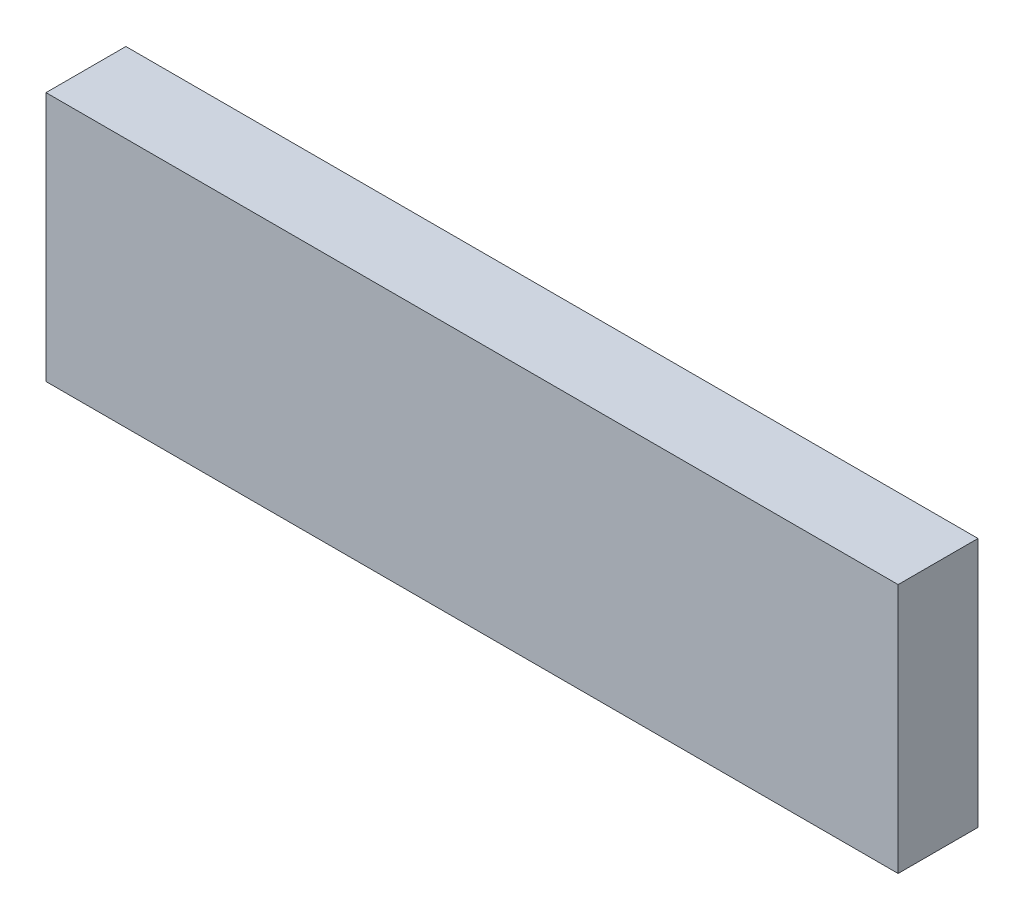
ISO-10303-21;
HEADER;
FILE_DESCRIPTION(('STEP AP214'),'2;1');
FILE_NAME('part.step','',(''),(''),'','','');
FILE_SCHEMA(('AUTOMOTIVE_DESIGN { 1 0 10303 214 1 1 1 1 }'));
ENDSEC;
DATA;
#1=APPLICATION_CONTEXT('core data for automotive mechanical design processes');
#2=APPLICATION_PROTOCOL_DEFINITION('international standard','automotive_design',2000,#1);
#3=PRODUCT_CONTEXT('',#1,'mechanical');
#4=PRODUCT('Part','Part','',(#3));
#5=PRODUCT_RELATED_PRODUCT_CATEGORY('part','',(#4));
#6=PRODUCT_DEFINITION_FORMATION('','',#4);
#7=PRODUCT_DEFINITION_CONTEXT('part definition',#1,'design');
#8=PRODUCT_DEFINITION('design','',#6,#7);
#9=PRODUCT_DEFINITION_SHAPE('','',#8);
#10=(LENGTH_UNIT() NAMED_UNIT(*) SI_UNIT(.MILLI.,.METRE.));
#11=(NAMED_UNIT(*) PLANE_ANGLE_UNIT() SI_UNIT($,.RADIAN.));
#12=(NAMED_UNIT(*) SI_UNIT($,.STERADIAN.) SOLID_ANGLE_UNIT());
#13=UNCERTAINTY_MEASURE_WITH_UNIT(LENGTH_MEASURE(1.E-05),#10,'distance_accuracy_value','');
#14=(GEOMETRIC_REPRESENTATION_CONTEXT(3) GLOBAL_UNCERTAINTY_ASSIGNED_CONTEXT((#13)) GLOBAL_UNIT_ASSIGNED_CONTEXT((#10,
#11,#12)) REPRESENTATION_CONTEXT('',''));
#15=CARTESIAN_POINT('',(0.,0.,0.));
#16=DIRECTION('',(0.,0.,1.));
#17=DIRECTION('',(1.,0.,0.));
#18=AXIS2_PLACEMENT_3D('',#15,#16,#17);
#19=CARTESIAN_POINT('',(21.4376,7.62,5.));
#20=DIRECTION('',(0.,0.,-1.));
#21=DIRECTION('',(-1.,0.,0.));
#22=AXIS2_PLACEMENT_3D('',#19,#20,#21);
#23=PLANE('',#22);
#24=DIRECTION('',(0.,1.,0.));
#25=VECTOR('',#24,1.);
#26=CARTESIAN_POINT('',(-10.5664,7.62,5.));
#27=LINE('',#26,#25);
#28=CARTESIAN_POINT('',(-10.5664,7.62,5.));
#29=VERTEX_POINT('',#28);
#30=CARTESIAN_POINT('',(-10.5664,-1.778,5.));
#31=VERTEX_POINT('',#30);
#32=EDGE_CURVE('E55',#29,#31,#27,.F.);
#33=ORIENTED_EDGE('',*,*,#32,.T.);
#34=DIRECTION('',(1.,0.,0.));
#35=VECTOR('',#34,1.);
#36=CARTESIAN_POINT('',(-10.5664,-1.778,5.));
#37=LINE('',#36,#35);
#38=CARTESIAN_POINT('',(21.4376,-1.778,5.));
#39=VERTEX_POINT('',#38);
#40=EDGE_CURVE('E57',#31,#39,#37,.T.);
#41=ORIENTED_EDGE('',*,*,#40,.T.);
#42=DIRECTION('',(0.,1.,0.));
#43=VECTOR('',#42,1.);
#44=CARTESIAN_POINT('',(21.4376,-1.778,5.));
#45=LINE('',#44,#43);
#46=CARTESIAN_POINT('',(21.4376,7.62,5.));
#47=VERTEX_POINT('',#46);
#48=EDGE_CURVE('E20',#39,#47,#45,.T.);
#49=ORIENTED_EDGE('',*,*,#48,.T.);
#50=DIRECTION('',(1.,0.,0.));
#51=VECTOR('',#50,1.);
#52=CARTESIAN_POINT('',(21.4376,7.62,5.));
#53=LINE('',#52,#51);
#54=EDGE_CURVE('E80',#47,#29,#53,.F.);
#55=ORIENTED_EDGE('',*,*,#54,.T.);
#56=EDGE_LOOP('',(#33,#41,#49,#55));
#57=FACE_BOUND('',#56,.T.);
#58=ADVANCED_FACE('F17',(#57),#23,.F.);
#59=CARTESIAN_POINT('',(21.4376,-1.778,2.));
#60=DIRECTION('',(-1.,0.,0.));
#61=DIRECTION('',(0.,0.,1.));
#62=AXIS2_PLACEMENT_3D('',#59,#60,#61);
#63=PLANE('',#62);
#64=DIRECTION('',(0.,0.,-1.));
#65=VECTOR('',#64,1.);
#66=CARTESIAN_POINT('',(21.4376,7.62,2.));
#67=LINE('',#66,#65);
#68=CARTESIAN_POINT('',(21.4376,7.62,2.));
#69=VERTEX_POINT('',#68);
#70=EDGE_CURVE('E68',#69,#47,#67,.F.);
#71=ORIENTED_EDGE('',*,*,#70,.T.);
#72=ORIENTED_EDGE('',*,*,#48,.F.);
#73=DIRECTION('',(0.,0.,1.));
#74=VECTOR('',#73,1.);
#75=CARTESIAN_POINT('',(21.4376,-1.778,2.));
#76=LINE('',#75,#74);
#77=CARTESIAN_POINT('',(21.4376,-1.778,2.));
#78=VERTEX_POINT('',#77);
#79=EDGE_CURVE('E63',#39,#78,#76,.F.);
#80=ORIENTED_EDGE('',*,*,#79,.T.);
#81=DIRECTION('',(0.,1.,0.));
#82=VECTOR('',#81,1.);
#83=CARTESIAN_POINT('',(21.4376,7.62,2.));
#84=LINE('',#83,#82);
#85=EDGE_CURVE('E83',#69,#78,#84,.F.);
#86=ORIENTED_EDGE('',*,*,#85,.F.);
#87=EDGE_LOOP('',(#71,#72,#80,#86));
#88=FACE_BOUND('',#87,.T.);
#89=ADVANCED_FACE('F65',(#88),#63,.F.);
#90=CARTESIAN_POINT('',(-10.5664,-1.778,2.));
#91=DIRECTION('',(0.,1.,0.));
#92=DIRECTION('',(0.,0.,1.));
#93=AXIS2_PLACEMENT_3D('',#90,#91,#92);
#94=PLANE('',#93);
#95=ORIENTED_EDGE('',*,*,#79,.F.);
#96=ORIENTED_EDGE('',*,*,#40,.F.);
#97=DIRECTION('',(0.,0.,-1.));
#98=VECTOR('',#97,1.);
#99=CARTESIAN_POINT('',(-10.5664,-1.778,2.));
#100=LINE('',#99,#98);
#101=CARTESIAN_POINT('',(-10.5664,-1.778,2.));
#102=VERTEX_POINT('',#101);
#103=EDGE_CURVE('E75',#31,#102,#100,.T.);
#104=ORIENTED_EDGE('',*,*,#103,.T.);
#105=DIRECTION('',(-1.,0.,0.));
#106=VECTOR('',#105,1.);
#107=CARTESIAN_POINT('',(21.4376,-1.778,2.));
#108=LINE('',#107,#106);
#109=EDGE_CURVE('E72',#78,#102,#108,.T.);
#110=ORIENTED_EDGE('',*,*,#109,.F.);
#111=EDGE_LOOP('',(#95,#96,#104,#110));
#112=FACE_BOUND('',#111,.T.);
#113=ADVANCED_FACE('F70',(#112),#94,.F.);
#114=CARTESIAN_POINT('',(-10.5664,7.62,2.));
#115=DIRECTION('',(1.,0.,0.));
#116=DIRECTION('',(0.,0.,-1.));
#117=AXIS2_PLACEMENT_3D('',#114,#115,#116);
#118=PLANE('',#117);
#119=ORIENTED_EDGE('',*,*,#103,.F.);
#120=ORIENTED_EDGE('',*,*,#32,.F.);
#121=DIRECTION('',(0.,0.,-1.));
#122=VECTOR('',#121,1.);
#123=CARTESIAN_POINT('',(-10.5664,7.62,2.));
#124=LINE('',#123,#122);
#125=CARTESIAN_POINT('',(-10.5664,7.62,2.));
#126=VERTEX_POINT('',#125);
#127=EDGE_CURVE('E35',#29,#126,#124,.T.);
#128=ORIENTED_EDGE('',*,*,#127,.T.);
#129=DIRECTION('',(0.,1.,0.));
#130=VECTOR('',#129,1.);
#131=CARTESIAN_POINT('',(-10.5664,7.62,2.));
#132=LINE('',#131,#130);
#133=EDGE_CURVE('E26',#102,#126,#132,.T.);
#134=ORIENTED_EDGE('',*,*,#133,.F.);
#135=EDGE_LOOP('',(#119,#120,#128,#134));
#136=FACE_BOUND('',#135,.T.);
#137=ADVANCED_FACE('F89',(#136),#118,.F.);
#138=CARTESIAN_POINT('',(21.4376,7.62,2.));
#139=DIRECTION('',(0.,-1.,0.));
#140=DIRECTION('',(0.,0.,-1.));
#141=AXIS2_PLACEMENT_3D('',#138,#139,#140);
#142=PLANE('',#141);
#143=ORIENTED_EDGE('',*,*,#127,.F.);
#144=ORIENTED_EDGE('',*,*,#54,.F.);
#145=ORIENTED_EDGE('',*,*,#70,.F.);
#146=DIRECTION('',(-1.,0.,0.));
#147=VECTOR('',#146,1.);
#148=CARTESIAN_POINT('',(21.4376,7.62,2.));
#149=LINE('',#148,#147);
#150=EDGE_CURVE('E11',#126,#69,#149,.F.);
#151=ORIENTED_EDGE('',*,*,#150,.F.);
#152=EDGE_LOOP('',(#143,#144,#145,#151));
#153=FACE_BOUND('',#152,.T.);
#154=ADVANCED_FACE('F91',(#153),#142,.F.);
#155=CARTESIAN_POINT('',(21.4376,7.62,2.));
#156=DIRECTION('',(0.,0.,-1.));
#157=DIRECTION('',(-1.,0.,0.));
#158=AXIS2_PLACEMENT_3D('',#155,#156,#157);
#159=PLANE('',#158);
#160=ORIENTED_EDGE('',*,*,#133,.T.);
#161=ORIENTED_EDGE('',*,*,#150,.T.);
#162=ORIENTED_EDGE('',*,*,#85,.T.);
#163=ORIENTED_EDGE('',*,*,#109,.T.);
#164=EDGE_LOOP('',(#160,#161,#162,#163));
#165=FACE_BOUND('',#164,.T.);
#166=ADVANCED_FACE('F88',(#165),#159,.T.);
#167=CLOSED_SHELL('',(#58,#89,#113,#137,#154,#166));
#168=MANIFOLD_SOLID_BREP('B1',#167);
#169=ADVANCED_BREP_SHAPE_REPRESENTATION('',(#18,#168),#14);
#170=SHAPE_DEFINITION_REPRESENTATION(#9,#169);
ENDSEC;
END-ISO-10303-21;
